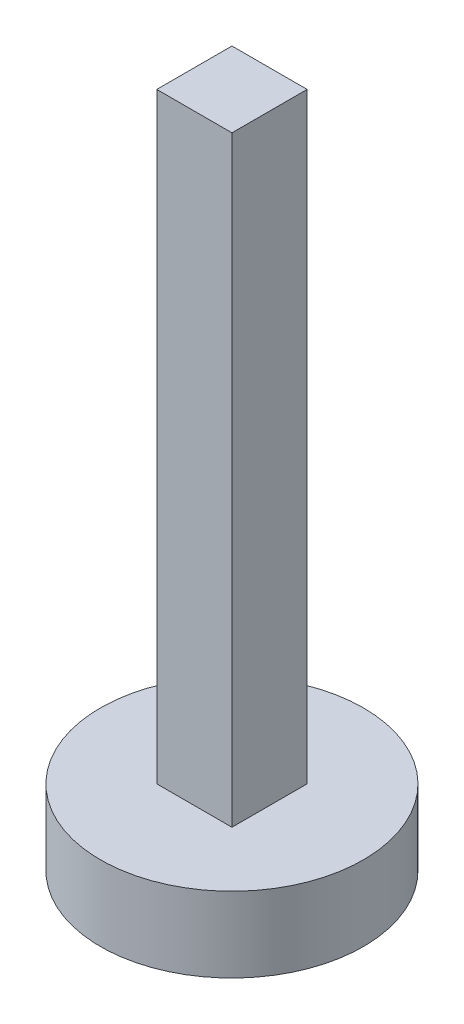
ISO-10303-21;
HEADER;
FILE_DESCRIPTION(('STEP AP214'),'2;1');
FILE_NAME('part.step','',(''),(''),'','','');
FILE_SCHEMA(('AUTOMOTIVE_DESIGN { 1 0 10303 214 1 1 1 1 }'));
ENDSEC;
DATA;
#1=APPLICATION_CONTEXT('core data for automotive mechanical design processes');
#2=APPLICATION_PROTOCOL_DEFINITION('international standard','automotive_design',2000,#1);
#3=PRODUCT_CONTEXT('',#1,'mechanical');
#4=PRODUCT('Part','Part','',(#3));
#5=PRODUCT_RELATED_PRODUCT_CATEGORY('part','',(#4));
#6=PRODUCT_DEFINITION_FORMATION('','',#4);
#7=PRODUCT_DEFINITION_CONTEXT('part definition',#1,'design');
#8=PRODUCT_DEFINITION('design','',#6,#7);
#9=PRODUCT_DEFINITION_SHAPE('','',#8);
#10=(LENGTH_UNIT() NAMED_UNIT(*) SI_UNIT(.MILLI.,.METRE.));
#11=(NAMED_UNIT(*) PLANE_ANGLE_UNIT() SI_UNIT($,.RADIAN.));
#12=(NAMED_UNIT(*) SI_UNIT($,.STERADIAN.) SOLID_ANGLE_UNIT());
#13=UNCERTAINTY_MEASURE_WITH_UNIT(LENGTH_MEASURE(1.E-05),#10,'distance_accuracy_value','');
#14=(GEOMETRIC_REPRESENTATION_CONTEXT(3) GLOBAL_UNCERTAINTY_ASSIGNED_CONTEXT((#13)) GLOBAL_UNIT_ASSIGNED_CONTEXT((#10,
#11,#12)) REPRESENTATION_CONTEXT('',''));
#15=CARTESIAN_POINT('',(0.,0.,0.));
#16=DIRECTION('',(0.,0.,1.));
#17=DIRECTION('',(1.,0.,0.));
#18=AXIS2_PLACEMENT_3D('',#15,#16,#17);
#19=CARTESIAN_POINT('',(5.,80.,5.));
#20=DIRECTION('',(-1.,0.,0.));
#21=DIRECTION('',(0.,0.,1.));
#22=AXIS2_PLACEMENT_3D('',#19,#20,#21);
#23=PLANE('',#22);
#24=DIRECTION('',(0.,0.,-1.));
#25=VECTOR('',#24,1.);
#26=CARTESIAN_POINT('',(5.,0.,5.));
#27=LINE('',#26,#25);
#28=CARTESIAN_POINT('',(5.,0.,5.));
#29=VERTEX_POINT('',#28);
#30=CARTESIAN_POINT('',(5.,0.,-5.));
#31=VERTEX_POINT('',#30);
#32=EDGE_CURVE('E77',#29,#31,#27,.T.);
#33=ORIENTED_EDGE('',*,*,#32,.T.);
#34=DIRECTION('',(0.,-1.,0.));
#35=VECTOR('',#34,1.);
#36=CARTESIAN_POINT('',(5.,80.,-5.));
#37=LINE('',#36,#35);
#38=CARTESIAN_POINT('',(5.,80.,-5.));
#39=VERTEX_POINT('',#38);
#40=EDGE_CURVE('E11',#39,#31,#37,.T.);
#41=ORIENTED_EDGE('',*,*,#40,.F.);
#42=DIRECTION('',(0.,0.,-1.));
#43=VECTOR('',#42,1.);
#44=CARTESIAN_POINT('',(5.,80.,5.));
#45=LINE('',#44,#43);
#46=CARTESIAN_POINT('',(5.,80.,5.));
#47=VERTEX_POINT('',#46);
#48=EDGE_CURVE('E103',#47,#39,#45,.T.);
#49=ORIENTED_EDGE('',*,*,#48,.F.);
#50=DIRECTION('',(0.,-1.,0.));
#51=VECTOR('',#50,1.);
#52=CARTESIAN_POINT('',(5.,80.,5.));
#53=LINE('',#52,#51);
#54=EDGE_CURVE('E91',#47,#29,#53,.T.);
#55=ORIENTED_EDGE('',*,*,#54,.T.);
#56=EDGE_LOOP('',(#33,#41,#49,#55));
#57=FACE_BOUND('',#56,.T.);
#58=ADVANCED_FACE('F37',(#57),#23,.F.);
#59=CARTESIAN_POINT('',(-5.,80.,-5.));
#60=DIRECTION('',(0.,0.,1.));
#61=DIRECTION('',(1.,0.,0.));
#62=AXIS2_PLACEMENT_3D('',#59,#60,#61);
#63=PLANE('',#62);
#64=DIRECTION('',(-1.,0.,0.));
#65=VECTOR('',#64,1.);
#66=CARTESIAN_POINT('',(-5.,0.,-5.));
#67=LINE('',#66,#65);
#68=CARTESIAN_POINT('',(-5.,0.,-5.));
#69=VERTEX_POINT('',#68);
#70=EDGE_CURVE('E73',#31,#69,#67,.T.);
#71=ORIENTED_EDGE('',*,*,#70,.T.);
#72=DIRECTION('',(0.,-1.,0.));
#73=VECTOR('',#72,1.);
#74=CARTESIAN_POINT('',(-5.,80.,-5.));
#75=LINE('',#74,#73);
#76=CARTESIAN_POINT('',(-5.,80.,-5.));
#77=VERTEX_POINT('',#76);
#78=EDGE_CURVE('E45',#77,#69,#75,.T.);
#79=ORIENTED_EDGE('',*,*,#78,.F.);
#80=DIRECTION('',(-1.,0.,0.));
#81=VECTOR('',#80,1.);
#82=CARTESIAN_POINT('',(-5.,80.,-5.));
#83=LINE('',#82,#81);
#84=EDGE_CURVE('E87',#39,#77,#83,.T.);
#85=ORIENTED_EDGE('',*,*,#84,.F.);
#86=ORIENTED_EDGE('',*,*,#40,.T.);
#87=EDGE_LOOP('',(#71,#79,#85,#86));
#88=FACE_BOUND('',#87,.T.);
#89=ADVANCED_FACE('F86',(#88),#63,.F.);
#90=CARTESIAN_POINT('',(-5.,80.,5.));
#91=DIRECTION('',(1.,0.,0.));
#92=DIRECTION('',(0.,0.,-1.));
#93=AXIS2_PLACEMENT_3D('',#90,#91,#92);
#94=PLANE('',#93);
#95=DIRECTION('',(0.,0.,1.));
#96=VECTOR('',#95,1.);
#97=CARTESIAN_POINT('',(-5.,0.,5.));
#98=LINE('',#97,#96);
#99=CARTESIAN_POINT('',(-5.,0.,5.));
#100=VERTEX_POINT('',#99);
#101=EDGE_CURVE('E80',#69,#100,#98,.T.);
#102=ORIENTED_EDGE('',*,*,#101,.T.);
#103=DIRECTION('',(0.,-1.,0.));
#104=VECTOR('',#103,1.);
#105=CARTESIAN_POINT('',(-5.,80.,5.));
#106=LINE('',#105,#104);
#107=CARTESIAN_POINT('',(-5.,80.,5.));
#108=VERTEX_POINT('',#107);
#109=EDGE_CURVE('E105',#108,#100,#106,.T.);
#110=ORIENTED_EDGE('',*,*,#109,.F.);
#111=DIRECTION('',(0.,0.,1.));
#112=VECTOR('',#111,1.);
#113=CARTESIAN_POINT('',(-5.,80.,5.));
#114=LINE('',#113,#112);
#115=EDGE_CURVE('E111',#77,#108,#114,.T.);
#116=ORIENTED_EDGE('',*,*,#115,.F.);
#117=ORIENTED_EDGE('',*,*,#78,.T.);
#118=EDGE_LOOP('',(#102,#110,#116,#117));
#119=FACE_BOUND('',#118,.T.);
#120=ADVANCED_FACE('F109',(#119),#94,.F.);
#121=CARTESIAN_POINT('',(-5.,80.,5.));
#122=DIRECTION('',(0.,0.,-1.));
#123=DIRECTION('',(-1.,0.,0.));
#124=AXIS2_PLACEMENT_3D('',#121,#122,#123);
#125=PLANE('',#124);
#126=DIRECTION('',(1.,0.,0.));
#127=VECTOR('',#126,1.);
#128=CARTESIAN_POINT('',(-5.,0.,5.));
#129=LINE('',#128,#127);
#130=EDGE_CURVE('E101',#100,#29,#129,.T.);
#131=ORIENTED_EDGE('',*,*,#130,.T.);
#132=ORIENTED_EDGE('',*,*,#54,.F.);
#133=DIRECTION('',(1.,0.,0.));
#134=VECTOR('',#133,1.);
#135=CARTESIAN_POINT('',(-5.,80.,5.));
#136=LINE('',#135,#134);
#137=EDGE_CURVE('E52',#108,#47,#136,.T.);
#138=ORIENTED_EDGE('',*,*,#137,.F.);
#139=ORIENTED_EDGE('',*,*,#109,.T.);
#140=EDGE_LOOP('',(#131,#132,#138,#139));
#141=FACE_BOUND('',#140,.T.);
#142=ADVANCED_FACE('F135',(#141),#125,.F.);
#143=CARTESIAN_POINT('',(0.,80.,0.));
#144=DIRECTION('',(0.,-1.,0.));
#145=DIRECTION('',(0.,0.,-1.));
#146=AXIS2_PLACEMENT_3D('',#143,#144,#145);
#147=PLANE('',#146);
#148=ORIENTED_EDGE('',*,*,#48,.T.);
#149=ORIENTED_EDGE('',*,*,#84,.T.);
#150=ORIENTED_EDGE('',*,*,#115,.T.);
#151=ORIENTED_EDGE('',*,*,#137,.T.);
#152=EDGE_LOOP('',(#148,#149,#150,#151));
#153=FACE_BOUND('',#152,.T.);
#154=ADVANCED_FACE('F140',(#153),#147,.F.);
#155=CARTESIAN_POINT('',(0.,-10.,0.));
#156=DIRECTION('',(0.,1.,0.));
#157=DIRECTION('',(0.,0.,1.));
#158=AXIS2_PLACEMENT_3D('',#155,#156,#157);
#159=CYLINDRICAL_SURFACE('',#158,17.5);
#160=CARTESIAN_POINT('',(0.,-10.,0.));
#161=DIRECTION('',(0.,-1.,0.));
#162=DIRECTION('',(0.,0.,-1.));
#163=AXIS2_PLACEMENT_3D('',#160,#161,#162);
#164=CIRCLE('',#163,17.5);
#165=CARTESIAN_POINT('',(0.,-10.,-17.5));
#166=VERTEX_POINT('',#165);
#167=EDGE_CURVE('E92',#166,#166,#164,.T.);
#168=ORIENTED_EDGE('',*,*,#167,.F.);
#169=EDGE_LOOP('',(#168));
#170=FACE_BOUND('',#169,.T.);
#171=CARTESIAN_POINT('',(0.,0.,0.));
#172=DIRECTION('',(0.,-1.,0.));
#173=DIRECTION('',(0.,0.,-1.));
#174=AXIS2_PLACEMENT_3D('',#171,#172,#173);
#175=CIRCLE('',#174,17.5);
#176=CARTESIAN_POINT('',(0.,0.,-17.5));
#177=VERTEX_POINT('',#176);
#178=EDGE_CURVE('E95',#177,#177,#175,.T.);
#179=ORIENTED_EDGE('',*,*,#178,.T.);
#180=EDGE_LOOP('',(#179));
#181=FACE_BOUND('',#180,.T.);
#182=ADVANCED_FACE('F118',(#170,#181),#159,.T.);
#183=CARTESIAN_POINT('',(0.,-10.,0.));
#184=DIRECTION('',(0.,-1.,0.));
#185=DIRECTION('',(0.,0.,-1.));
#186=AXIS2_PLACEMENT_3D('',#183,#184,#185);
#187=PLANE('',#186);
#188=ORIENTED_EDGE('',*,*,#167,.T.);
#189=EDGE_LOOP('',(#188));
#190=FACE_BOUND('',#189,.T.);
#191=ADVANCED_FACE('F120',(#190),#187,.T.);
#192=CARTESIAN_POINT('',(0.,0.,0.));
#193=DIRECTION('',(0.,-1.,0.));
#194=DIRECTION('',(0.,0.,-1.));
#195=AXIS2_PLACEMENT_3D('',#192,#193,#194);
#196=PLANE('',#195);
#197=ORIENTED_EDGE('',*,*,#32,.F.);
#198=ORIENTED_EDGE('',*,*,#130,.F.);
#199=ORIENTED_EDGE('',*,*,#101,.F.);
#200=ORIENTED_EDGE('',*,*,#70,.F.);
#201=EDGE_LOOP('',(#197,#198,#199,#200));
#202=FACE_BOUND('',#201,.T.);
#203=ORIENTED_EDGE('',*,*,#178,.F.);
#204=EDGE_LOOP('',(#203));
#205=FACE_BOUND('',#204,.T.);
#206=ADVANCED_FACE('F74',(#202,#205),#196,.F.);
#207=CLOSED_SHELL('',(#58,#89,#120,#142,#154,#182,#191,#206));
#208=MANIFOLD_SOLID_BREP('B2',#207);
#209=ADVANCED_BREP_SHAPE_REPRESENTATION('',(#18,#208),#14);
#210=SHAPE_DEFINITION_REPRESENTATION(#9,#209);
ENDSEC;
END-ISO-10303-21;
